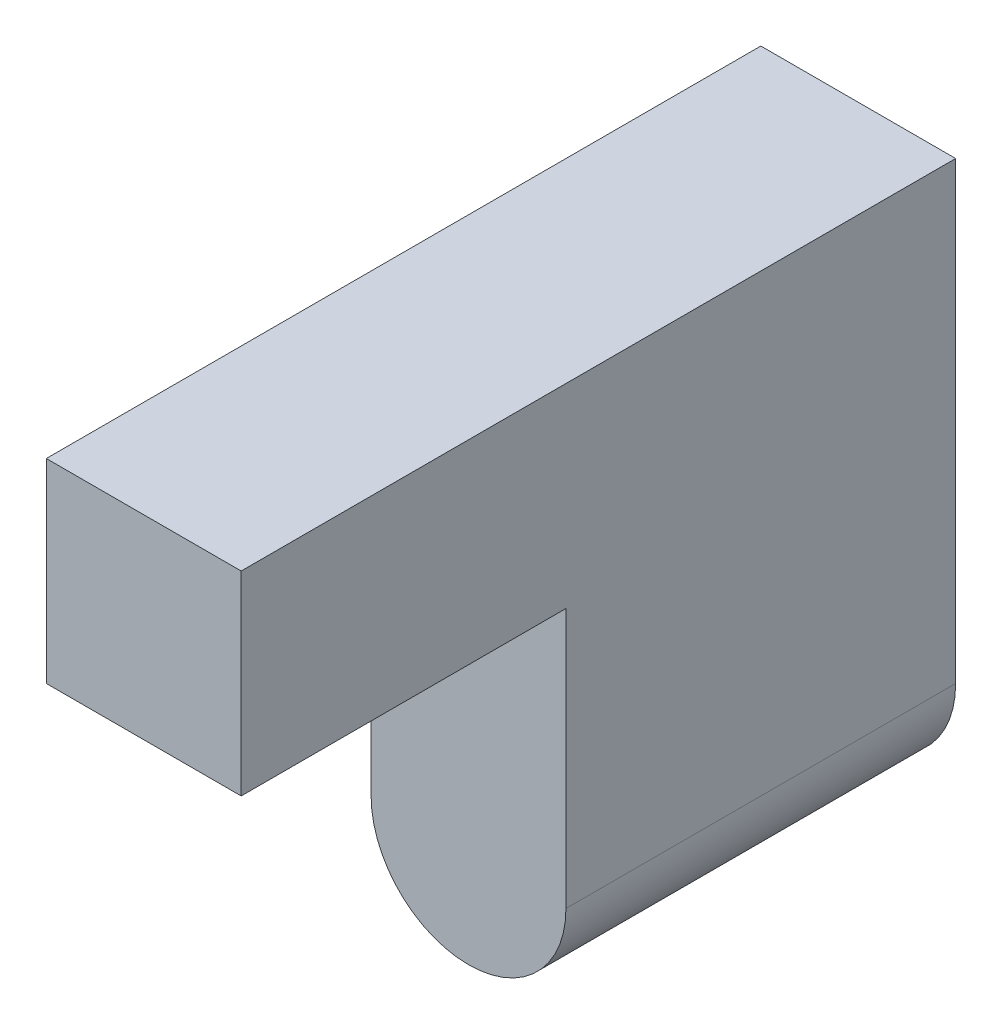
ISO-10303-21;
HEADER;
FILE_DESCRIPTION(('STEP AP214'),'2;1');
FILE_NAME('part.step','',(''),(''),'','','');
FILE_SCHEMA(('AUTOMOTIVE_DESIGN { 1 0 10303 214 1 1 1 1 }'));
ENDSEC;
DATA;
#1=APPLICATION_CONTEXT('core data for automotive mechanical design processes');
#2=APPLICATION_PROTOCOL_DEFINITION('international standard','automotive_design',2000,#1);
#3=PRODUCT_CONTEXT('',#1,'mechanical');
#4=PRODUCT('Part','Part','',(#3));
#5=PRODUCT_RELATED_PRODUCT_CATEGORY('part','',(#4));
#6=PRODUCT_DEFINITION_FORMATION('','',#4);
#7=PRODUCT_DEFINITION_CONTEXT('part definition',#1,'design');
#8=PRODUCT_DEFINITION('design','',#6,#7);
#9=PRODUCT_DEFINITION_SHAPE('','',#8);
#10=(LENGTH_UNIT() NAMED_UNIT(*) SI_UNIT(.MILLI.,.METRE.));
#11=(NAMED_UNIT(*) PLANE_ANGLE_UNIT() SI_UNIT($,.RADIAN.));
#12=(NAMED_UNIT(*) SI_UNIT($,.STERADIAN.) SOLID_ANGLE_UNIT());
#13=UNCERTAINTY_MEASURE_WITH_UNIT(LENGTH_MEASURE(1.E-05),#10,'distance_accuracy_value','');
#14=(GEOMETRIC_REPRESENTATION_CONTEXT(3) GLOBAL_UNCERTAINTY_ASSIGNED_CONTEXT((#13)) GLOBAL_UNIT_ASSIGNED_CONTEXT((#10,
#11,#12)) REPRESENTATION_CONTEXT('',''));
#15=CARTESIAN_POINT('',(0.,0.,0.));
#16=DIRECTION('',(0.,0.,1.));
#17=DIRECTION('',(1.,0.,0.));
#18=AXIS2_PLACEMENT_3D('',#15,#16,#17);
#19=CARTESIAN_POINT('',(0.,-3.5,6.));
#20=DIRECTION('',(0.,0.,-1.));
#21=DIRECTION('',(-1.,0.,0.));
#22=AXIS2_PLACEMENT_3D('',#19,#20,#21);
#23=CYLINDRICAL_SURFACE('',#22,1.5);
#24=CARTESIAN_POINT('',(0.,-3.5,0.));
#25=DIRECTION('',(0.,0.,1.));
#26=DIRECTION('',(1.,0.,0.));
#27=AXIS2_PLACEMENT_3D('',#24,#25,#26);
#28=CIRCLE('',#27,1.5);
#29=CARTESIAN_POINT('',(1.5,-3.5,0.));
#30=VERTEX_POINT('',#29);
#31=CARTESIAN_POINT('',(-1.5,-3.5,0.));
#32=VERTEX_POINT('',#31);
#33=EDGE_CURVE('E79',#30,#32,#28,.F.);
#34=ORIENTED_EDGE('',*,*,#33,.F.);
#35=DIRECTION('',(0.,0.,-1.));
#36=VECTOR('',#35,1.);
#37=CARTESIAN_POINT('',(1.5,-3.5,6.));
#38=LINE('',#37,#36);
#39=CARTESIAN_POINT('',(1.5,-3.5,6.));
#40=VERTEX_POINT('',#39);
#41=EDGE_CURVE('E11',#40,#30,#38,.T.);
#42=ORIENTED_EDGE('',*,*,#41,.F.);
#43=CARTESIAN_POINT('',(0.,-3.5,6.));
#44=DIRECTION('',(0.,0.,1.));
#45=DIRECTION('',(1.,0.,0.));
#46=AXIS2_PLACEMENT_3D('',#43,#44,#45);
#47=CIRCLE('',#46,1.5);
#48=CARTESIAN_POINT('',(-1.5,-3.5,6.));
#49=VERTEX_POINT('',#48);
#50=EDGE_CURVE('E77',#40,#49,#47,.F.);
#51=ORIENTED_EDGE('',*,*,#50,.T.);
#52=DIRECTION('',(0.,0.,-1.));
#53=VECTOR('',#52,1.);
#54=CARTESIAN_POINT('',(-1.5,-3.5,6.));
#55=LINE('',#54,#53);
#56=EDGE_CURVE('E43',#49,#32,#55,.T.);
#57=ORIENTED_EDGE('',*,*,#56,.T.);
#58=EDGE_LOOP('',(#34,#42,#51,#57));
#59=FACE_BOUND('',#58,.T.);
#60=ADVANCED_FACE('F35',(#59),#23,.T.);
#61=CARTESIAN_POINT('',(1.5,0.,6.));
#62=DIRECTION('',(1.,0.,0.));
#63=DIRECTION('',(0.,0.,-1.));
#64=AXIS2_PLACEMENT_3D('',#61,#62,#63);
#65=PLANE('',#64);
#66=DIRECTION('',(0.,-1.,0.));
#67=VECTOR('',#66,1.);
#68=CARTESIAN_POINT('',(1.5,0.,0.));
#69=LINE('',#68,#67);
#70=CARTESIAN_POINT('',(1.5,3.5,0.));
#71=VERTEX_POINT('',#70);
#72=EDGE_CURVE('E96',#71,#30,#69,.T.);
#73=ORIENTED_EDGE('',*,*,#72,.F.);
#74=DIRECTION('',(0.,0.,-1.));
#75=VECTOR('',#74,1.);
#76=CARTESIAN_POINT('',(1.5,3.5,11.));
#77=LINE('',#76,#75);
#78=CARTESIAN_POINT('',(1.5,3.5,11.));
#79=VERTEX_POINT('',#78);
#80=EDGE_CURVE('E97',#79,#71,#77,.T.);
#81=ORIENTED_EDGE('',*,*,#80,.F.);
#82=DIRECTION('',(0.,-1.,0.));
#83=VECTOR('',#82,1.);
#84=CARTESIAN_POINT('',(1.5,0.,11.));
#85=LINE('',#84,#83);
#86=CARTESIAN_POINT('',(1.5,0.5,11.));
#87=VERTEX_POINT('',#86);
#88=EDGE_CURVE('E130',#79,#87,#85,.T.);
#89=ORIENTED_EDGE('',*,*,#88,.T.);
#90=DIRECTION('',(0.,0.,-1.));
#91=VECTOR('',#90,1.);
#92=CARTESIAN_POINT('',(1.5,0.5,11.));
#93=LINE('',#92,#91);
#94=CARTESIAN_POINT('',(1.5,0.5,6.));
#95=VERTEX_POINT('',#94);
#96=EDGE_CURVE('E88',#87,#95,#93,.T.);
#97=ORIENTED_EDGE('',*,*,#96,.T.);
#98=DIRECTION('',(0.,-1.,0.));
#99=VECTOR('',#98,1.);
#100=CARTESIAN_POINT('',(1.5,0.,6.));
#101=LINE('',#100,#99);
#102=EDGE_CURVE('E67',#95,#40,#101,.T.);
#103=ORIENTED_EDGE('',*,*,#102,.T.);
#104=ORIENTED_EDGE('',*,*,#41,.T.);
#105=EDGE_LOOP('',(#73,#81,#89,#97,#103,#104));
#106=FACE_BOUND('',#105,.T.);
#107=ADVANCED_FACE('F85',(#106),#65,.T.);
#108=CARTESIAN_POINT('',(-1.5,0.,6.));
#109=DIRECTION('',(1.,0.,0.));
#110=DIRECTION('',(0.,0.,-1.));
#111=AXIS2_PLACEMENT_3D('',#108,#109,#110);
#112=PLANE('',#111);
#113=DIRECTION('',(0.,-1.,0.));
#114=VECTOR('',#113,1.);
#115=CARTESIAN_POINT('',(-1.5,0.,0.));
#116=LINE('',#115,#114);
#117=CARTESIAN_POINT('',(-1.5,3.5,0.));
#118=VERTEX_POINT('',#117);
#119=EDGE_CURVE('E82',#118,#32,#116,.T.);
#120=ORIENTED_EDGE('',*,*,#119,.T.);
#121=ORIENTED_EDGE('',*,*,#56,.F.);
#122=DIRECTION('',(0.,-1.,0.));
#123=VECTOR('',#122,1.);
#124=CARTESIAN_POINT('',(-1.5,0.,6.));
#125=LINE('',#124,#123);
#126=CARTESIAN_POINT('',(-1.5,0.5,6.));
#127=VERTEX_POINT('',#126);
#128=EDGE_CURVE('E51',#127,#49,#125,.T.);
#129=ORIENTED_EDGE('',*,*,#128,.F.);
#130=DIRECTION('',(0.,0.,-1.));
#131=VECTOR('',#130,1.);
#132=CARTESIAN_POINT('',(-1.5,0.5,11.));
#133=LINE('',#132,#131);
#134=CARTESIAN_POINT('',(-1.5,0.5,11.));
#135=VERTEX_POINT('',#134);
#136=EDGE_CURVE('E122',#135,#127,#133,.T.);
#137=ORIENTED_EDGE('',*,*,#136,.F.);
#138=DIRECTION('',(0.,-1.,0.));
#139=VECTOR('',#138,1.);
#140=CARTESIAN_POINT('',(-1.5,0.,11.));
#141=LINE('',#140,#139);
#142=CARTESIAN_POINT('',(-1.5,3.5,11.));
#143=VERTEX_POINT('',#142);
#144=EDGE_CURVE('E132',#143,#135,#141,.T.);
#145=ORIENTED_EDGE('',*,*,#144,.F.);
#146=DIRECTION('',(0.,0.,-1.));
#147=VECTOR('',#146,1.);
#148=CARTESIAN_POINT('',(-1.5,3.5,11.));
#149=LINE('',#148,#147);
#150=EDGE_CURVE('E106',#143,#118,#149,.T.);
#151=ORIENTED_EDGE('',*,*,#150,.T.);
#152=EDGE_LOOP('',(#120,#121,#129,#137,#145,#151));
#153=FACE_BOUND('',#152,.T.);
#154=ADVANCED_FACE('F103',(#153),#112,.F.);
#155=CARTESIAN_POINT('',(0.,0.,6.));
#156=DIRECTION('',(0.,0.,1.));
#157=DIRECTION('',(1.,0.,0.));
#158=AXIS2_PLACEMENT_3D('',#155,#156,#157);
#159=PLANE('',#158);
#160=ORIENTED_EDGE('',*,*,#50,.F.);
#161=ORIENTED_EDGE('',*,*,#102,.F.);
#162=DIRECTION('',(1.,0.,0.));
#163=VECTOR('',#162,1.);
#164=CARTESIAN_POINT('',(0.,0.5,6.));
#165=LINE('',#164,#163);
#166=EDGE_CURVE('E89',#127,#95,#165,.T.);
#167=ORIENTED_EDGE('',*,*,#166,.F.);
#168=ORIENTED_EDGE('',*,*,#128,.T.);
#169=EDGE_LOOP('',(#160,#161,#167,#168));
#170=FACE_BOUND('',#169,.T.);
#171=ADVANCED_FACE('F81',(#170),#159,.T.);
#172=CARTESIAN_POINT('',(0.,0.,0.));
#173=DIRECTION('',(0.,0.,1.));
#174=DIRECTION('',(1.,0.,0.));
#175=AXIS2_PLACEMENT_3D('',#172,#173,#174);
#176=PLANE('',#175);
#177=ORIENTED_EDGE('',*,*,#33,.T.);
#178=ORIENTED_EDGE('',*,*,#119,.F.);
#179=DIRECTION('',(1.,0.,0.));
#180=VECTOR('',#179,1.);
#181=CARTESIAN_POINT('',(0.,3.5,0.));
#182=LINE('',#181,#180);
#183=EDGE_CURVE('E112',#118,#71,#182,.T.);
#184=ORIENTED_EDGE('',*,*,#183,.T.);
#185=ORIENTED_EDGE('',*,*,#72,.T.);
#186=EDGE_LOOP('',(#177,#178,#184,#185));
#187=FACE_BOUND('',#186,.T.);
#188=ADVANCED_FACE('F110',(#187),#176,.F.);
#189=CARTESIAN_POINT('',(0.,0.5,11.));
#190=DIRECTION('',(0.,1.,0.));
#191=DIRECTION('',(0.,0.,1.));
#192=AXIS2_PLACEMENT_3D('',#189,#190,#191);
#193=PLANE('',#192);
#194=ORIENTED_EDGE('',*,*,#136,.T.);
#195=ORIENTED_EDGE('',*,*,#166,.T.);
#196=ORIENTED_EDGE('',*,*,#96,.F.);
#197=DIRECTION('',(1.,0.,0.));
#198=VECTOR('',#197,1.);
#199=CARTESIAN_POINT('',(0.,0.5,11.));
#200=LINE('',#199,#198);
#201=EDGE_CURVE('E128',#135,#87,#200,.T.);
#202=ORIENTED_EDGE('',*,*,#201,.F.);
#203=EDGE_LOOP('',(#194,#195,#196,#202));
#204=FACE_BOUND('',#203,.T.);
#205=ADVANCED_FACE('F145',(#204),#193,.F.);
#206=CARTESIAN_POINT('',(0.,3.5,11.));
#207=DIRECTION('',(0.,1.,0.));
#208=DIRECTION('',(0.,0.,1.));
#209=AXIS2_PLACEMENT_3D('',#206,#207,#208);
#210=PLANE('',#209);
#211=ORIENTED_EDGE('',*,*,#183,.F.);
#212=ORIENTED_EDGE('',*,*,#150,.F.);
#213=DIRECTION('',(1.,0.,0.));
#214=VECTOR('',#213,1.);
#215=CARTESIAN_POINT('',(0.,3.5,11.));
#216=LINE('',#215,#214);
#217=EDGE_CURVE('E121',#143,#79,#216,.T.);
#218=ORIENTED_EDGE('',*,*,#217,.T.);
#219=ORIENTED_EDGE('',*,*,#80,.T.);
#220=EDGE_LOOP('',(#211,#212,#218,#219));
#221=FACE_BOUND('',#220,.T.);
#222=ADVANCED_FACE('F119',(#221),#210,.T.);
#223=CARTESIAN_POINT('',(0.,0.,11.));
#224=DIRECTION('',(0.,0.,1.));
#225=DIRECTION('',(1.,0.,0.));
#226=AXIS2_PLACEMENT_3D('',#223,#224,#225);
#227=PLANE('',#226);
#228=ORIENTED_EDGE('',*,*,#88,.F.);
#229=ORIENTED_EDGE('',*,*,#217,.F.);
#230=ORIENTED_EDGE('',*,*,#144,.T.);
#231=ORIENTED_EDGE('',*,*,#201,.T.);
#232=EDGE_LOOP('',(#228,#229,#230,#231));
#233=FACE_BOUND('',#232,.T.);
#234=ADVANCED_FACE('F137',(#233),#227,.T.);
#235=CLOSED_SHELL('',(#60,#107,#154,#171,#188,#205,#222,#234));
#236=MANIFOLD_SOLID_BREP('B2',#235);
#237=ADVANCED_BREP_SHAPE_REPRESENTATION('',(#18,#236),#14);
#238=SHAPE_DEFINITION_REPRESENTATION(#9,#237);
ENDSEC;
END-ISO-10303-21;
